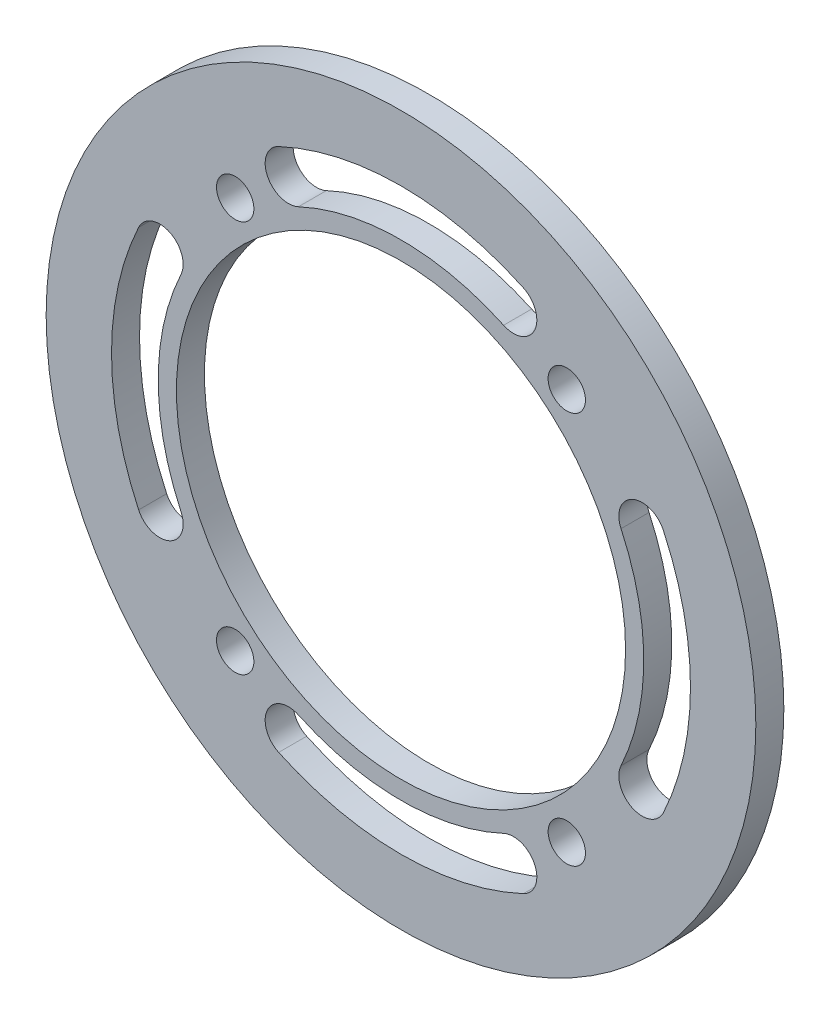
ISO-10303-21;
HEADER;
FILE_DESCRIPTION(('STEP AP214'),'2;1');
FILE_NAME('part.step','',(''),(''),'','','');
FILE_SCHEMA(('AUTOMOTIVE_DESIGN { 1 0 10303 214 1 1 1 1 }'));
ENDSEC;
DATA;
#1=APPLICATION_CONTEXT('core data for automotive mechanical design processes');
#2=APPLICATION_PROTOCOL_DEFINITION('international standard','automotive_design',2000,#1);
#3=PRODUCT_CONTEXT('',#1,'mechanical');
#4=PRODUCT('Part','Part','',(#3));
#5=PRODUCT_RELATED_PRODUCT_CATEGORY('part','',(#4));
#6=PRODUCT_DEFINITION_FORMATION('','',#4);
#7=PRODUCT_DEFINITION_CONTEXT('part definition',#1,'design');
#8=PRODUCT_DEFINITION('design','',#6,#7);
#9=PRODUCT_DEFINITION_SHAPE('','',#8);
#10=(LENGTH_UNIT() NAMED_UNIT(*) SI_UNIT(.MILLI.,.METRE.));
#11=(NAMED_UNIT(*) PLANE_ANGLE_UNIT() SI_UNIT($,.RADIAN.));
#12=(NAMED_UNIT(*) SI_UNIT($,.STERADIAN.) SOLID_ANGLE_UNIT());
#13=UNCERTAINTY_MEASURE_WITH_UNIT(LENGTH_MEASURE(1.E-05),#10,'distance_accuracy_value','');
#14=(GEOMETRIC_REPRESENTATION_CONTEXT(3) GLOBAL_UNCERTAINTY_ASSIGNED_CONTEXT((#13)) GLOBAL_UNIT_ASSIGNED_CONTEXT((#10,
#11,#12)) REPRESENTATION_CONTEXT('',''));
#15=CARTESIAN_POINT('',(0.,0.,0.));
#16=DIRECTION('',(0.,0.,1.));
#17=DIRECTION('',(1.,0.,0.));
#18=AXIS2_PLACEMENT_3D('',#15,#16,#17);
#19=CARTESIAN_POINT('',(0.,0.,3.));
#20=DIRECTION('',(0.,0.,1.));
#21=DIRECTION('',(1.,0.,0.));
#22=AXIS2_PLACEMENT_3D('',#19,#20,#21);
#23=PLANE('',#22);
#24=CARTESIAN_POINT('',(25.8297719305446,-12.0446204596098,3.));
#25=DIRECTION('',(0.,0.,1.));
#26=DIRECTION('',(1.,0.,0.));
#27=AXIS2_PLACEMENT_3D('',#24,#25,#26);
#28=CIRCLE('',#27,2.49999999999999);
#29=CARTESIAN_POINT('',(23.564002462953,-10.988074805258,3.));
#30=VERTEX_POINT('',#29);
#31=CARTESIAN_POINT('',(28.0955413981362,-13.1011661139615,3.));
#32=VERTEX_POINT('',#31);
#33=EDGE_CURVE('E51',#30,#32,#28,.T.);
#34=ORIENTED_EDGE('',*,*,#33,.F.);
#35=CARTESIAN_POINT('',(0.,0.,3.));
#36=DIRECTION('',(0.,0.,-1.));
#37=DIRECTION('',(1.,0.,0.));
#38=AXIS2_PLACEMENT_3D('',#35,#36,#37);
#39=CIRCLE('',#38,26.);
#40=CARTESIAN_POINT('',(23.564002462953,10.988074805258,3.));
#41=VERTEX_POINT('',#40);
#42=EDGE_CURVE('E172',#41,#30,#39,.T.);
#43=ORIENTED_EDGE('',*,*,#42,.F.);
#44=CARTESIAN_POINT('',(25.8297719305446,12.0446204596098,3.));
#45=DIRECTION('',(0.,0.,1.));
#46=DIRECTION('',(1.,0.,0.));
#47=AXIS2_PLACEMENT_3D('',#44,#45,#46);
#48=CIRCLE('',#47,2.5);
#49=CARTESIAN_POINT('',(28.0955413981362,13.1011661139615,3.));
#50=VERTEX_POINT('',#49);
#51=EDGE_CURVE('E156',#50,#41,#48,.T.);
#52=ORIENTED_EDGE('',*,*,#51,.F.);
#53=CARTESIAN_POINT('',(0.,0.,3.));
#54=DIRECTION('',(0.,0.,1.));
#55=DIRECTION('',(1.,0.,0.));
#56=AXIS2_PLACEMENT_3D('',#53,#54,#55);
#57=CIRCLE('',#56,31.);
#58=EDGE_CURVE('E166',#32,#50,#57,.T.);
#59=ORIENTED_EDGE('',*,*,#58,.F.);
#60=EDGE_LOOP('',(#34,#43,#52,#59));
#61=FACE_BOUND('',#60,.T.);
#62=CARTESIAN_POINT('',(-12.0446204596099,-25.8297719305446,3.));
#63=DIRECTION('',(0.,0.,1.));
#64=DIRECTION('',(1.,0.,0.));
#65=AXIS2_PLACEMENT_3D('',#62,#63,#64);
#66=CIRCLE('',#65,2.5);
#67=CARTESIAN_POINT('',(-10.9880748052581,-23.5640024629529,3.));
#68=VERTEX_POINT('',#67);
#69=CARTESIAN_POINT('',(-13.1011661139616,-28.0955413981362,3.));
#70=VERTEX_POINT('',#69);
#71=EDGE_CURVE('E59',#68,#70,#66,.T.);
#72=ORIENTED_EDGE('',*,*,#71,.F.);
#73=CARTESIAN_POINT('',(0.,0.,3.));
#74=DIRECTION('',(0.,0.,-1.));
#75=DIRECTION('',(1.,0.,0.));
#76=AXIS2_PLACEMENT_3D('',#73,#74,#75);
#77=CIRCLE('',#76,26.);
#78=CARTESIAN_POINT('',(10.988074805258,-23.564002462953,3.));
#79=VERTEX_POINT('',#78);
#80=EDGE_CURVE('E190',#79,#68,#77,.T.);
#81=ORIENTED_EDGE('',*,*,#80,.F.);
#82=CARTESIAN_POINT('',(12.0446204596097,-25.8297719305446,3.));
#83=DIRECTION('',(0.,0.,1.));
#84=DIRECTION('',(1.,0.,0.));
#85=AXIS2_PLACEMENT_3D('',#82,#83,#84);
#86=CIRCLE('',#85,2.49999999999999);
#87=CARTESIAN_POINT('',(13.1011661139614,-28.0955413981363,3.));
#88=VERTEX_POINT('',#87);
#89=EDGE_CURVE('E187',#88,#79,#86,.T.);
#90=ORIENTED_EDGE('',*,*,#89,.F.);
#91=CARTESIAN_POINT('',(0.,0.,3.));
#92=DIRECTION('',(0.,0.,1.));
#93=DIRECTION('',(1.,0.,0.));
#94=AXIS2_PLACEMENT_3D('',#91,#92,#93);
#95=CIRCLE('',#94,31.);
#96=EDGE_CURVE('E183',#70,#88,#95,.T.);
#97=ORIENTED_EDGE('',*,*,#96,.F.);
#98=EDGE_LOOP('',(#72,#81,#90,#97));
#99=FACE_BOUND('',#98,.T.);
#100=CARTESIAN_POINT('',(-25.8297719305445,12.0446204596099,3.));
#101=DIRECTION('',(0.,0.,1.));
#102=DIRECTION('',(1.,0.,0.));
#103=AXIS2_PLACEMENT_3D('',#100,#101,#102);
#104=CIRCLE('',#103,2.49999999999999);
#105=CARTESIAN_POINT('',(-23.5640024629529,10.9880748052582,3.));
#106=VERTEX_POINT('',#105);
#107=CARTESIAN_POINT('',(-28.0955413981361,13.1011661139617,3.));
#108=VERTEX_POINT('',#107);
#109=EDGE_CURVE('E201',#106,#108,#104,.T.);
#110=ORIENTED_EDGE('',*,*,#109,.F.);
#111=CARTESIAN_POINT('',(0.,0.,3.));
#112=DIRECTION('',(0.,0.,-1.));
#113=DIRECTION('',(1.,0.,0.));
#114=AXIS2_PLACEMENT_3D('',#111,#112,#113);
#115=CIRCLE('',#114,26.);
#116=CARTESIAN_POINT('',(-23.564002462953,-10.9880748052579,3.));
#117=VERTEX_POINT('',#116);
#118=EDGE_CURVE('E210',#117,#106,#115,.T.);
#119=ORIENTED_EDGE('',*,*,#118,.F.);
#120=CARTESIAN_POINT('',(-25.8297719305447,-12.0446204596096,3.));
#121=DIRECTION('',(0.,0.,1.));
#122=DIRECTION('',(1.,0.,0.));
#123=AXIS2_PLACEMENT_3D('',#120,#121,#122);
#124=CIRCLE('',#123,2.5);
#125=CARTESIAN_POINT('',(-28.0955413981363,-13.1011661139613,3.));
#126=VERTEX_POINT('',#125);
#127=EDGE_CURVE('E207',#126,#117,#124,.T.);
#128=ORIENTED_EDGE('',*,*,#127,.F.);
#129=CARTESIAN_POINT('',(0.,0.,3.));
#130=DIRECTION('',(0.,0.,1.));
#131=DIRECTION('',(1.,0.,0.));
#132=AXIS2_PLACEMENT_3D('',#129,#130,#131);
#133=CIRCLE('',#132,31.);
#134=EDGE_CURVE('E203',#108,#126,#133,.T.);
#135=ORIENTED_EDGE('',*,*,#134,.F.);
#136=EDGE_LOOP('',(#110,#119,#128,#135));
#137=FACE_BOUND('',#136,.T.);
#138=CARTESIAN_POINT('',(12.04462045961,25.8297719305445,3.));
#139=DIRECTION('',(0.,0.,1.));
#140=DIRECTION('',(1.,0.,0.));
#141=AXIS2_PLACEMENT_3D('',#138,#139,#140);
#142=CIRCLE('',#141,2.49999999999999);
#143=CARTESIAN_POINT('',(10.9880748052583,23.5640024629528,3.));
#144=VERTEX_POINT('',#143);
#145=CARTESIAN_POINT('',(13.1011661139618,28.0955413981361,3.));
#146=VERTEX_POINT('',#145);
#147=EDGE_CURVE('E221',#144,#146,#142,.T.);
#148=ORIENTED_EDGE('',*,*,#147,.F.);
#149=CARTESIAN_POINT('',(0.,0.,3.));
#150=DIRECTION('',(0.,0.,-1.));
#151=DIRECTION('',(1.,0.,0.));
#152=AXIS2_PLACEMENT_3D('',#149,#150,#151);
#153=CIRCLE('',#152,26.);
#154=CARTESIAN_POINT('',(-10.9880748052578,23.5640024629531,3.));
#155=VERTEX_POINT('',#154);
#156=EDGE_CURVE('E229',#155,#144,#153,.T.);
#157=ORIENTED_EDGE('',*,*,#156,.F.);
#158=CARTESIAN_POINT('',(-12.0446204596095,25.8297719305447,3.));
#159=DIRECTION('',(0.,0.,1.));
#160=DIRECTION('',(1.,0.,0.));
#161=AXIS2_PLACEMENT_3D('',#158,#159,#160);
#162=CIRCLE('',#161,2.5);
#163=CARTESIAN_POINT('',(-13.1011661139612,28.0955413981364,3.));
#164=VERTEX_POINT('',#163);
#165=EDGE_CURVE('E226',#164,#155,#162,.T.);
#166=ORIENTED_EDGE('',*,*,#165,.F.);
#167=CARTESIAN_POINT('',(0.,0.,3.));
#168=DIRECTION('',(0.,0.,1.));
#169=DIRECTION('',(1.,0.,0.));
#170=AXIS2_PLACEMENT_3D('',#167,#168,#169);
#171=CIRCLE('',#170,31.);
#172=EDGE_CURVE('E223',#146,#164,#171,.T.);
#173=ORIENTED_EDGE('',*,*,#172,.F.);
#174=EDGE_LOOP('',(#148,#157,#166,#173));
#175=FACE_BOUND('',#174,.T.);
#176=CARTESIAN_POINT('',(17.7552809045647,21.,3.));
#177=DIRECTION('',(0.,0.,1.));
#178=DIRECTION('',(-1.,0.,0.));
#179=AXIS2_PLACEMENT_3D('',#176,#177,#178);
#180=CIRCLE('',#179,2.);
#181=CARTESIAN_POINT('',(15.7552809045647,21.,3.));
#182=VERTEX_POINT('',#181);
#183=EDGE_CURVE('E243',#182,#182,#180,.T.);
#184=ORIENTED_EDGE('',*,*,#183,.F.);
#185=EDGE_LOOP('',(#184));
#186=FACE_BOUND('',#185,.T.);
#187=CARTESIAN_POINT('',(-17.7552809045647,-21.,3.));
#188=DIRECTION('',(0.,0.,1.));
#189=DIRECTION('',(-1.,0.,0.));
#190=AXIS2_PLACEMENT_3D('',#187,#188,#189);
#191=CIRCLE('',#190,2.);
#192=CARTESIAN_POINT('',(-19.7552809045647,-21.,3.));
#193=VERTEX_POINT('',#192);
#194=EDGE_CURVE('E242',#193,#193,#191,.T.);
#195=ORIENTED_EDGE('',*,*,#194,.F.);
#196=EDGE_LOOP('',(#195));
#197=FACE_BOUND('',#196,.T.);
#198=CARTESIAN_POINT('',(-17.7552809045647,21.,3.));
#199=DIRECTION('',(0.,0.,1.));
#200=DIRECTION('',(1.,0.,0.));
#201=AXIS2_PLACEMENT_3D('',#198,#199,#200);
#202=CIRCLE('',#201,2.);
#203=CARTESIAN_POINT('',(-15.7552809045647,21.,3.));
#204=VERTEX_POINT('',#203);
#205=EDGE_CURVE('E179',#204,#204,#202,.T.);
#206=ORIENTED_EDGE('',*,*,#205,.F.);
#207=EDGE_LOOP('',(#206));
#208=FACE_BOUND('',#207,.T.);
#209=CARTESIAN_POINT('',(17.7552809045647,-21.,3.));
#210=DIRECTION('',(0.,0.,1.));
#211=DIRECTION('',(1.,0.,0.));
#212=AXIS2_PLACEMENT_3D('',#209,#210,#211);
#213=CIRCLE('',#212,2.);
#214=CARTESIAN_POINT('',(19.7552809045647,-21.,3.));
#215=VERTEX_POINT('',#214);
#216=EDGE_CURVE('E246',#215,#215,#213,.T.);
#217=ORIENTED_EDGE('',*,*,#216,.F.);
#218=EDGE_LOOP('',(#217));
#219=FACE_BOUND('',#218,.T.);
#220=CARTESIAN_POINT('',(0.,0.,3.));
#221=DIRECTION('',(0.,0.,1.));
#222=DIRECTION('',(1.,0.,0.));
#223=AXIS2_PLACEMENT_3D('',#220,#221,#222);
#224=CIRCLE('',#223,38.);
#225=CARTESIAN_POINT('',(38.,0.,3.));
#226=VERTEX_POINT('',#225);
#227=EDGE_CURVE('E260',#226,#226,#224,.T.);
#228=ORIENTED_EDGE('',*,*,#227,.T.);
#229=EDGE_LOOP('',(#228));
#230=FACE_BOUND('',#229,.T.);
#231=CARTESIAN_POINT('',(0.,0.,3.));
#232=DIRECTION('',(0.,0.,1.));
#233=DIRECTION('',(1.,0.,0.));
#234=AXIS2_PLACEMENT_3D('',#231,#232,#233);
#235=CIRCLE('',#234,24.05);
#236=CARTESIAN_POINT('',(24.05,0.,3.));
#237=VERTEX_POINT('',#236);
#238=EDGE_CURVE('E252',#237,#237,#235,.T.);
#239=ORIENTED_EDGE('',*,*,#238,.F.);
#240=EDGE_LOOP('',(#239));
#241=FACE_BOUND('',#240,.T.);
#242=ADVANCED_FACE('F36',(#61,#99,#137,#175,#186,#197,#208,#219,#230,#241),#23,.T.);
#243=CARTESIAN_POINT('',(0.,0.,0.));
#244=DIRECTION('',(0.,0.,1.));
#245=DIRECTION('',(1.,0.,0.));
#246=AXIS2_PLACEMENT_3D('',#243,#244,#245);
#247=PLANE('',#246);
#248=CARTESIAN_POINT('',(0.,0.,0.));
#249=DIRECTION('',(0.,0.,1.));
#250=DIRECTION('',(1.,0.,0.));
#251=AXIS2_PLACEMENT_3D('',#248,#249,#250);
#252=CIRCLE('',#251,26.);
#253=CARTESIAN_POINT('',(23.564002462953,10.988074805258,0.));
#254=VERTEX_POINT('',#253);
#255=CARTESIAN_POINT('',(23.564002462953,-10.988074805258,0.));
#256=VERTEX_POINT('',#255);
#257=EDGE_CURVE('E44',#254,#256,#252,.F.);
#258=ORIENTED_EDGE('',*,*,#257,.T.);
#259=CARTESIAN_POINT('',(25.8297719305446,-12.0446204596098,0.));
#260=DIRECTION('',(0.,0.,1.));
#261=DIRECTION('',(1.,0.,0.));
#262=AXIS2_PLACEMENT_3D('',#259,#260,#261);
#263=CIRCLE('',#262,2.49999999999999);
#264=CARTESIAN_POINT('',(28.0955413981362,-13.1011661139615,0.));
#265=VERTEX_POINT('',#264);
#266=EDGE_CURVE('E11',#256,#265,#263,.T.);
#267=ORIENTED_EDGE('',*,*,#266,.T.);
#268=CARTESIAN_POINT('',(0.,0.,0.));
#269=DIRECTION('',(0.,0.,1.));
#270=DIRECTION('',(1.,0.,0.));
#271=AXIS2_PLACEMENT_3D('',#268,#269,#270);
#272=CIRCLE('',#271,31.);
#273=CARTESIAN_POINT('',(28.0955413981362,13.1011661139615,0.));
#274=VERTEX_POINT('',#273);
#275=EDGE_CURVE('E311',#265,#274,#272,.T.);
#276=ORIENTED_EDGE('',*,*,#275,.T.);
#277=CARTESIAN_POINT('',(25.8297719305446,12.0446204596098,0.));
#278=DIRECTION('',(0.,0.,1.));
#279=DIRECTION('',(1.,0.,0.));
#280=AXIS2_PLACEMENT_3D('',#277,#278,#279);
#281=CIRCLE('',#280,2.5);
#282=EDGE_CURVE('E159',#274,#254,#281,.T.);
#283=ORIENTED_EDGE('',*,*,#282,.T.);
#284=EDGE_LOOP('',(#258,#267,#276,#283));
#285=FACE_BOUND('',#284,.T.);
#286=CARTESIAN_POINT('',(0.,0.,0.));
#287=DIRECTION('',(0.,0.,1.));
#288=DIRECTION('',(1.,0.,0.));
#289=AXIS2_PLACEMENT_3D('',#286,#287,#288);
#290=CIRCLE('',#289,26.);
#291=CARTESIAN_POINT('',(10.988074805258,-23.564002462953,0.));
#292=VERTEX_POINT('',#291);
#293=CARTESIAN_POINT('',(-10.9880748052581,-23.5640024629529,0.));
#294=VERTEX_POINT('',#293);
#295=EDGE_CURVE('E305',#292,#294,#290,.F.);
#296=ORIENTED_EDGE('',*,*,#295,.T.);
#297=CARTESIAN_POINT('',(-12.0446204596099,-25.8297719305446,0.));
#298=DIRECTION('',(0.,0.,1.));
#299=DIRECTION('',(1.,0.,0.));
#300=AXIS2_PLACEMENT_3D('',#297,#298,#299);
#301=CIRCLE('',#300,2.5);
#302=CARTESIAN_POINT('',(-13.1011661139616,-28.0955413981362,0.));
#303=VERTEX_POINT('',#302);
#304=EDGE_CURVE('E308',#294,#303,#301,.T.);
#305=ORIENTED_EDGE('',*,*,#304,.T.);
#306=CARTESIAN_POINT('',(0.,0.,0.));
#307=DIRECTION('',(0.,0.,1.));
#308=DIRECTION('',(1.,0.,0.));
#309=AXIS2_PLACEMENT_3D('',#306,#307,#308);
#310=CIRCLE('',#309,31.);
#311=CARTESIAN_POINT('',(13.1011661139614,-28.0955413981363,0.));
#312=VERTEX_POINT('',#311);
#313=EDGE_CURVE('E299',#303,#312,#310,.T.);
#314=ORIENTED_EDGE('',*,*,#313,.T.);
#315=CARTESIAN_POINT('',(12.0446204596097,-25.8297719305446,0.));
#316=DIRECTION('',(0.,0.,1.));
#317=DIRECTION('',(1.,0.,0.));
#318=AXIS2_PLACEMENT_3D('',#315,#316,#317);
#319=CIRCLE('',#318,2.49999999999999);
#320=EDGE_CURVE('E302',#312,#292,#319,.T.);
#321=ORIENTED_EDGE('',*,*,#320,.T.);
#322=EDGE_LOOP('',(#296,#305,#314,#321));
#323=FACE_BOUND('',#322,.T.);
#324=CARTESIAN_POINT('',(0.,0.,0.));
#325=DIRECTION('',(0.,0.,1.));
#326=DIRECTION('',(1.,0.,0.));
#327=AXIS2_PLACEMENT_3D('',#324,#325,#326);
#328=CIRCLE('',#327,26.);
#329=CARTESIAN_POINT('',(-23.564002462953,-10.9880748052579,0.));
#330=VERTEX_POINT('',#329);
#331=CARTESIAN_POINT('',(-23.5640024629529,10.9880748052582,0.));
#332=VERTEX_POINT('',#331);
#333=EDGE_CURVE('E293',#330,#332,#328,.F.);
#334=ORIENTED_EDGE('',*,*,#333,.T.);
#335=CARTESIAN_POINT('',(-25.8297719305445,12.0446204596099,0.));
#336=DIRECTION('',(0.,0.,1.));
#337=DIRECTION('',(1.,0.,0.));
#338=AXIS2_PLACEMENT_3D('',#335,#336,#337);
#339=CIRCLE('',#338,2.49999999999999);
#340=CARTESIAN_POINT('',(-28.0955413981361,13.1011661139617,0.));
#341=VERTEX_POINT('',#340);
#342=EDGE_CURVE('E296',#332,#341,#339,.T.);
#343=ORIENTED_EDGE('',*,*,#342,.T.);
#344=CARTESIAN_POINT('',(0.,0.,0.));
#345=DIRECTION('',(0.,0.,1.));
#346=DIRECTION('',(1.,0.,0.));
#347=AXIS2_PLACEMENT_3D('',#344,#345,#346);
#348=CIRCLE('',#347,31.);
#349=CARTESIAN_POINT('',(-28.0955413981363,-13.1011661139613,0.));
#350=VERTEX_POINT('',#349);
#351=EDGE_CURVE('E287',#341,#350,#348,.T.);
#352=ORIENTED_EDGE('',*,*,#351,.T.);
#353=CARTESIAN_POINT('',(-25.8297719305447,-12.0446204596096,0.));
#354=DIRECTION('',(0.,0.,1.));
#355=DIRECTION('',(1.,0.,0.));
#356=AXIS2_PLACEMENT_3D('',#353,#354,#355);
#357=CIRCLE('',#356,2.5);
#358=EDGE_CURVE('E290',#350,#330,#357,.T.);
#359=ORIENTED_EDGE('',*,*,#358,.T.);
#360=EDGE_LOOP('',(#334,#343,#352,#359));
#361=FACE_BOUND('',#360,.T.);
#362=CARTESIAN_POINT('',(0.,0.,0.));
#363=DIRECTION('',(0.,0.,1.));
#364=DIRECTION('',(1.,0.,0.));
#365=AXIS2_PLACEMENT_3D('',#362,#363,#364);
#366=CIRCLE('',#365,26.);
#367=CARTESIAN_POINT('',(-10.9880748052578,23.5640024629531,0.));
#368=VERTEX_POINT('',#367);
#369=CARTESIAN_POINT('',(10.9880748052583,23.5640024629528,0.));
#370=VERTEX_POINT('',#369);
#371=EDGE_CURVE('E281',#368,#370,#366,.F.);
#372=ORIENTED_EDGE('',*,*,#371,.T.);
#373=CARTESIAN_POINT('',(12.04462045961,25.8297719305445,0.));
#374=DIRECTION('',(0.,0.,1.));
#375=DIRECTION('',(1.,0.,0.));
#376=AXIS2_PLACEMENT_3D('',#373,#374,#375);
#377=CIRCLE('',#376,2.49999999999999);
#378=CARTESIAN_POINT('',(13.1011661139618,28.0955413981361,0.));
#379=VERTEX_POINT('',#378);
#380=EDGE_CURVE('E284',#370,#379,#377,.T.);
#381=ORIENTED_EDGE('',*,*,#380,.T.);
#382=CARTESIAN_POINT('',(0.,0.,0.));
#383=DIRECTION('',(0.,0.,1.));
#384=DIRECTION('',(1.,0.,0.));
#385=AXIS2_PLACEMENT_3D('',#382,#383,#384);
#386=CIRCLE('',#385,31.);
#387=CARTESIAN_POINT('',(-13.1011661139612,28.0955413981364,0.));
#388=VERTEX_POINT('',#387);
#389=EDGE_CURVE('E263',#379,#388,#386,.T.);
#390=ORIENTED_EDGE('',*,*,#389,.T.);
#391=CARTESIAN_POINT('',(-12.0446204596095,25.8297719305447,0.));
#392=DIRECTION('',(0.,0.,1.));
#393=DIRECTION('',(1.,0.,0.));
#394=AXIS2_PLACEMENT_3D('',#391,#392,#393);
#395=CIRCLE('',#394,2.5);
#396=EDGE_CURVE('E278',#388,#368,#395,.T.);
#397=ORIENTED_EDGE('',*,*,#396,.T.);
#398=EDGE_LOOP('',(#372,#381,#390,#397));
#399=FACE_BOUND('',#398,.T.);
#400=CARTESIAN_POINT('',(17.7552809045647,21.,0.));
#401=DIRECTION('',(0.,0.,1.));
#402=DIRECTION('',(1.,0.,0.));
#403=AXIS2_PLACEMENT_3D('',#400,#401,#402);
#404=CIRCLE('',#403,2.);
#405=CARTESIAN_POINT('',(19.7552809045647,21.,0.));
#406=VERTEX_POINT('',#405);
#407=EDGE_CURVE('E259',#406,#406,#404,.T.);
#408=ORIENTED_EDGE('',*,*,#407,.T.);
#409=EDGE_LOOP('',(#408));
#410=FACE_BOUND('',#409,.T.);
#411=CARTESIAN_POINT('',(-17.7552809045647,-21.,0.));
#412=DIRECTION('',(0.,0.,1.));
#413=DIRECTION('',(1.,0.,0.));
#414=AXIS2_PLACEMENT_3D('',#411,#412,#413);
#415=CIRCLE('',#414,2.);
#416=CARTESIAN_POINT('',(-15.7552809045647,-21.,0.));
#417=VERTEX_POINT('',#416);
#418=EDGE_CURVE('E271',#417,#417,#415,.T.);
#419=ORIENTED_EDGE('',*,*,#418,.T.);
#420=EDGE_LOOP('',(#419));
#421=FACE_BOUND('',#420,.T.);
#422=CARTESIAN_POINT('',(-17.7552809045647,21.,0.));
#423=DIRECTION('',(0.,0.,1.));
#424=DIRECTION('',(1.,0.,0.));
#425=AXIS2_PLACEMENT_3D('',#422,#423,#424);
#426=CIRCLE('',#425,2.);
#427=CARTESIAN_POINT('',(-15.7552809045647,21.,0.));
#428=VERTEX_POINT('',#427);
#429=EDGE_CURVE('E268',#428,#428,#426,.T.);
#430=ORIENTED_EDGE('',*,*,#429,.T.);
#431=EDGE_LOOP('',(#430));
#432=FACE_BOUND('',#431,.T.);
#433=CARTESIAN_POINT('',(17.7552809045647,-21.,0.));
#434=DIRECTION('',(0.,0.,1.));
#435=DIRECTION('',(1.,0.,0.));
#436=AXIS2_PLACEMENT_3D('',#433,#434,#435);
#437=CIRCLE('',#436,2.);
#438=CARTESIAN_POINT('',(19.7552809045647,-21.,0.));
#439=VERTEX_POINT('',#438);
#440=EDGE_CURVE('E251',#439,#439,#437,.T.);
#441=ORIENTED_EDGE('',*,*,#440,.T.);
#442=EDGE_LOOP('',(#441));
#443=FACE_BOUND('',#442,.T.);
#444=CARTESIAN_POINT('',(0.,0.,0.));
#445=DIRECTION('',(0.,0.,1.));
#446=DIRECTION('',(1.,0.,0.));
#447=AXIS2_PLACEMENT_3D('',#444,#445,#446);
#448=CIRCLE('',#447,38.);
#449=CARTESIAN_POINT('',(38.,0.,0.));
#450=VERTEX_POINT('',#449);
#451=EDGE_CURVE('E255',#450,#450,#448,.T.);
#452=ORIENTED_EDGE('',*,*,#451,.F.);
#453=EDGE_LOOP('',(#452));
#454=FACE_BOUND('',#453,.T.);
#455=CARTESIAN_POINT('',(0.,0.,0.));
#456=DIRECTION('',(0.,0.,1.));
#457=DIRECTION('',(1.,0.,0.));
#458=AXIS2_PLACEMENT_3D('',#455,#456,#457);
#459=CIRCLE('',#458,24.05);
#460=CARTESIAN_POINT('',(24.05,0.,0.));
#461=VERTEX_POINT('',#460);
#462=EDGE_CURVE('E256',#461,#461,#459,.T.);
#463=ORIENTED_EDGE('',*,*,#462,.T.);
#464=EDGE_LOOP('',(#463));
#465=FACE_BOUND('',#464,.T.);
#466=ADVANCED_FACE('F315',(#285,#323,#361,#399,#410,#421,#432,#443,#454,#465),#247,.F.);
#467=CARTESIAN_POINT('',(0.,0.,3.));
#468=DIRECTION('',(0.,0.,-1.));
#469=DIRECTION('',(-1.,0.,0.));
#470=AXIS2_PLACEMENT_3D('',#467,#468,#469);
#471=CYLINDRICAL_SURFACE('',#470,38.);
#472=ORIENTED_EDGE('',*,*,#227,.F.);
#473=EDGE_LOOP('',(#472));
#474=FACE_BOUND('',#473,.T.);
#475=ORIENTED_EDGE('',*,*,#451,.T.);
#476=EDGE_LOOP('',(#475));
#477=FACE_BOUND('',#476,.T.);
#478=ADVANCED_FACE('F38',(#474,#477),#471,.T.);
#479=CARTESIAN_POINT('',(0.,0.,3.));
#480=DIRECTION('',(0.,0.,-1.));
#481=DIRECTION('',(-1.,0.,0.));
#482=AXIS2_PLACEMENT_3D('',#479,#480,#481);
#483=CYLINDRICAL_SURFACE('',#482,24.05);
#484=ORIENTED_EDGE('',*,*,#238,.T.);
#485=EDGE_LOOP('',(#484));
#486=FACE_BOUND('',#485,.T.);
#487=ORIENTED_EDGE('',*,*,#462,.F.);
#488=EDGE_LOOP('',(#487));
#489=FACE_BOUND('',#488,.T.);
#490=ADVANCED_FACE('F340',(#486,#489),#483,.F.);
#491=CARTESIAN_POINT('',(17.7552809045647,-21.,-7.));
#492=DIRECTION('',(0.,0.,1.));
#493=DIRECTION('',(1.,0.,0.));
#494=AXIS2_PLACEMENT_3D('',#491,#492,#493);
#495=CYLINDRICAL_SURFACE('',#494,2.);
#496=ORIENTED_EDGE('',*,*,#216,.T.);
#497=EDGE_LOOP('',(#496));
#498=FACE_BOUND('',#497,.T.);
#499=ORIENTED_EDGE('',*,*,#440,.F.);
#500=EDGE_LOOP('',(#499));
#501=FACE_BOUND('',#500,.T.);
#502=ADVANCED_FACE('F343',(#498,#501),#495,.F.);
#503=CARTESIAN_POINT('',(-17.7552809045647,21.,-7.));
#504=DIRECTION('',(0.,0.,1.));
#505=DIRECTION('',(1.,0.,0.));
#506=AXIS2_PLACEMENT_3D('',#503,#504,#505);
#507=CYLINDRICAL_SURFACE('',#506,2.);
#508=ORIENTED_EDGE('',*,*,#205,.T.);
#509=EDGE_LOOP('',(#508));
#510=FACE_BOUND('',#509,.T.);
#511=ORIENTED_EDGE('',*,*,#429,.F.);
#512=EDGE_LOOP('',(#511));
#513=FACE_BOUND('',#512,.T.);
#514=ADVANCED_FACE('F347',(#510,#513),#507,.F.);
#515=CARTESIAN_POINT('',(-17.7552809045647,-21.,-7.));
#516=DIRECTION('',(0.,0.,1.));
#517=DIRECTION('',(1.,0.,0.));
#518=AXIS2_PLACEMENT_3D('',#515,#516,#517);
#519=CYLINDRICAL_SURFACE('',#518,2.);
#520=ORIENTED_EDGE('',*,*,#194,.T.);
#521=EDGE_LOOP('',(#520));
#522=FACE_BOUND('',#521,.T.);
#523=ORIENTED_EDGE('',*,*,#418,.F.);
#524=EDGE_LOOP('',(#523));
#525=FACE_BOUND('',#524,.T.);
#526=ADVANCED_FACE('F349',(#522,#525),#519,.F.);
#527=CARTESIAN_POINT('',(17.7552809045647,21.,-7.));
#528=DIRECTION('',(0.,0.,1.));
#529=DIRECTION('',(1.,0.,0.));
#530=AXIS2_PLACEMENT_3D('',#527,#528,#529);
#531=CYLINDRICAL_SURFACE('',#530,2.);
#532=ORIENTED_EDGE('',*,*,#183,.T.);
#533=EDGE_LOOP('',(#532));
#534=FACE_BOUND('',#533,.T.);
#535=ORIENTED_EDGE('',*,*,#407,.F.);
#536=EDGE_LOOP('',(#535));
#537=FACE_BOUND('',#536,.T.);
#538=ADVANCED_FACE('F352',(#534,#537),#531,.F.);
#539=CARTESIAN_POINT('',(12.04462045961,25.8297719305445,-7.));
#540=DIRECTION('',(0.,0.,1.));
#541=DIRECTION('',(1.,0.,0.));
#542=AXIS2_PLACEMENT_3D('',#539,#540,#541);
#543=CYLINDRICAL_SURFACE('',#542,2.49999999999999);
#544=DIRECTION('',(0.,0.,1.));
#545=VECTOR('',#544,1.);
#546=CARTESIAN_POINT('',(10.9880748052583,23.5640024629528,-7.));
#547=LINE('',#546,#545);
#548=EDGE_CURVE('E204',#370,#144,#547,.T.);
#549=ORIENTED_EDGE('',*,*,#548,.T.);
#550=ORIENTED_EDGE('',*,*,#147,.T.);
#551=DIRECTION('',(0.,0.,1.));
#552=VECTOR('',#551,1.);
#553=CARTESIAN_POINT('',(13.1011661139618,28.0955413981361,-7.));
#554=LINE('',#553,#552);
#555=EDGE_CURVE('E232',#379,#146,#554,.T.);
#556=ORIENTED_EDGE('',*,*,#555,.F.);
#557=ORIENTED_EDGE('',*,*,#380,.F.);
#558=EDGE_LOOP('',(#549,#550,#556,#557));
#559=FACE_BOUND('',#558,.T.);
#560=ADVANCED_FACE('F356',(#559),#543,.F.);
#561=CARTESIAN_POINT('',(0.,0.,-7.));
#562=DIRECTION('',(0.,0.,1.));
#563=DIRECTION('',(1.,0.,0.));
#564=AXIS2_PLACEMENT_3D('',#561,#562,#563);
#565=CYLINDRICAL_SURFACE('',#564,26.);
#566=DIRECTION('',(0.,0.,1.));
#567=VECTOR('',#566,1.);
#568=CARTESIAN_POINT('',(-10.9880748052578,23.5640024629531,-7.));
#569=LINE('',#568,#567);
#570=EDGE_CURVE('E234',#368,#155,#569,.T.);
#571=ORIENTED_EDGE('',*,*,#570,.T.);
#572=ORIENTED_EDGE('',*,*,#156,.T.);
#573=ORIENTED_EDGE('',*,*,#548,.F.);
#574=ORIENTED_EDGE('',*,*,#371,.F.);
#575=EDGE_LOOP('',(#571,#572,#573,#574));
#576=FACE_BOUND('',#575,.T.);
#577=ADVANCED_FACE('F363',(#576),#565,.T.);
#578=CARTESIAN_POINT('',(-12.0446204596095,25.8297719305447,-7.));
#579=DIRECTION('',(0.,0.,1.));
#580=DIRECTION('',(1.,0.,0.));
#581=AXIS2_PLACEMENT_3D('',#578,#579,#580);
#582=CYLINDRICAL_SURFACE('',#581,2.5);
#583=DIRECTION('',(0.,0.,1.));
#584=VECTOR('',#583,1.);
#585=CARTESIAN_POINT('',(-13.1011661139612,28.0955413981364,-7.));
#586=LINE('',#585,#584);
#587=EDGE_CURVE('E236',#388,#164,#586,.T.);
#588=ORIENTED_EDGE('',*,*,#587,.T.);
#589=ORIENTED_EDGE('',*,*,#165,.T.);
#590=ORIENTED_EDGE('',*,*,#570,.F.);
#591=ORIENTED_EDGE('',*,*,#396,.F.);
#592=EDGE_LOOP('',(#588,#589,#590,#591));
#593=FACE_BOUND('',#592,.T.);
#594=ADVANCED_FACE('F369',(#593),#582,.F.);
#595=CARTESIAN_POINT('',(0.,0.,-7.));
#596=DIRECTION('',(0.,0.,1.));
#597=DIRECTION('',(1.,0.,0.));
#598=AXIS2_PLACEMENT_3D('',#595,#596,#597);
#599=CYLINDRICAL_SURFACE('',#598,31.);
#600=ORIENTED_EDGE('',*,*,#555,.T.);
#601=ORIENTED_EDGE('',*,*,#172,.T.);
#602=ORIENTED_EDGE('',*,*,#587,.F.);
#603=ORIENTED_EDGE('',*,*,#389,.F.);
#604=EDGE_LOOP('',(#600,#601,#602,#603));
#605=FACE_BOUND('',#604,.T.);
#606=ADVANCED_FACE('F365',(#605),#599,.F.);
#607=CARTESIAN_POINT('',(-25.8297719305445,12.0446204596099,-7.));
#608=DIRECTION('',(0.,0.,1.));
#609=DIRECTION('',(1.,0.,0.));
#610=AXIS2_PLACEMENT_3D('',#607,#608,#609);
#611=CYLINDRICAL_SURFACE('',#610,2.49999999999999);
#612=DIRECTION('',(0.,0.,1.));
#613=VECTOR('',#612,1.);
#614=CARTESIAN_POINT('',(-23.5640024629529,10.9880748052582,-7.));
#615=LINE('',#614,#613);
#616=EDGE_CURVE('E184',#332,#106,#615,.T.);
#617=ORIENTED_EDGE('',*,*,#616,.T.);
#618=ORIENTED_EDGE('',*,*,#109,.T.);
#619=DIRECTION('',(0.,0.,1.));
#620=VECTOR('',#619,1.);
#621=CARTESIAN_POINT('',(-28.0955413981361,13.1011661139617,-7.));
#622=LINE('',#621,#620);
#623=EDGE_CURVE('E213',#341,#108,#622,.T.);
#624=ORIENTED_EDGE('',*,*,#623,.F.);
#625=ORIENTED_EDGE('',*,*,#342,.F.);
#626=EDGE_LOOP('',(#617,#618,#624,#625));
#627=FACE_BOUND('',#626,.T.);
#628=ADVANCED_FACE('F368',(#627),#611,.F.);
#629=CARTESIAN_POINT('',(0.,0.,-7.));
#630=DIRECTION('',(0.,0.,1.));
#631=DIRECTION('',(1.,0.,0.));
#632=AXIS2_PLACEMENT_3D('',#629,#630,#631);
#633=CYLINDRICAL_SURFACE('',#632,26.);
#634=DIRECTION('',(0.,0.,1.));
#635=VECTOR('',#634,1.);
#636=CARTESIAN_POINT('',(-23.564002462953,-10.9880748052579,-7.));
#637=LINE('',#636,#635);
#638=EDGE_CURVE('E215',#330,#117,#637,.T.);
#639=ORIENTED_EDGE('',*,*,#638,.T.);
#640=ORIENTED_EDGE('',*,*,#118,.T.);
#641=ORIENTED_EDGE('',*,*,#616,.F.);
#642=ORIENTED_EDGE('',*,*,#333,.F.);
#643=EDGE_LOOP('',(#639,#640,#641,#642));
#644=FACE_BOUND('',#643,.T.);
#645=ADVANCED_FACE('F379',(#644),#633,.T.);
#646=CARTESIAN_POINT('',(-25.8297719305447,-12.0446204596096,-7.));
#647=DIRECTION('',(0.,0.,1.));
#648=DIRECTION('',(1.,0.,0.));
#649=AXIS2_PLACEMENT_3D('',#646,#647,#648);
#650=CYLINDRICAL_SURFACE('',#649,2.5);
#651=DIRECTION('',(0.,0.,1.));
#652=VECTOR('',#651,1.);
#653=CARTESIAN_POINT('',(-28.0955413981363,-13.1011661139613,-7.));
#654=LINE('',#653,#652);
#655=EDGE_CURVE('E217',#350,#126,#654,.T.);
#656=ORIENTED_EDGE('',*,*,#655,.T.);
#657=ORIENTED_EDGE('',*,*,#127,.T.);
#658=ORIENTED_EDGE('',*,*,#638,.F.);
#659=ORIENTED_EDGE('',*,*,#358,.F.);
#660=EDGE_LOOP('',(#656,#657,#658,#659));
#661=FACE_BOUND('',#660,.T.);
#662=ADVANCED_FACE('F385',(#661),#650,.F.);
#663=CARTESIAN_POINT('',(0.,0.,-7.));
#664=DIRECTION('',(0.,0.,1.));
#665=DIRECTION('',(1.,0.,0.));
#666=AXIS2_PLACEMENT_3D('',#663,#664,#665);
#667=CYLINDRICAL_SURFACE('',#666,31.);
#668=ORIENTED_EDGE('',*,*,#623,.T.);
#669=ORIENTED_EDGE('',*,*,#134,.T.);
#670=ORIENTED_EDGE('',*,*,#655,.F.);
#671=ORIENTED_EDGE('',*,*,#351,.F.);
#672=EDGE_LOOP('',(#668,#669,#670,#671));
#673=FACE_BOUND('',#672,.T.);
#674=ADVANCED_FACE('F381',(#673),#667,.F.);
#675=CARTESIAN_POINT('',(-12.0446204596099,-25.8297719305446,-7.));
#676=DIRECTION('',(0.,0.,1.));
#677=DIRECTION('',(1.,0.,0.));
#678=AXIS2_PLACEMENT_3D('',#675,#676,#677);
#679=CYLINDRICAL_SURFACE('',#678,2.5);
#680=DIRECTION('',(0.,0.,1.));
#681=VECTOR('',#680,1.);
#682=CARTESIAN_POINT('',(-10.9880748052581,-23.5640024629529,-7.));
#683=LINE('',#682,#681);
#684=EDGE_CURVE('E194',#294,#68,#683,.T.);
#685=ORIENTED_EDGE('',*,*,#684,.T.);
#686=ORIENTED_EDGE('',*,*,#71,.T.);
#687=DIRECTION('',(0.,0.,1.));
#688=VECTOR('',#687,1.);
#689=CARTESIAN_POINT('',(-13.1011661139616,-28.0955413981362,-7.));
#690=LINE('',#689,#688);
#691=EDGE_CURVE('E193',#303,#70,#690,.T.);
#692=ORIENTED_EDGE('',*,*,#691,.F.);
#693=ORIENTED_EDGE('',*,*,#304,.F.);
#694=EDGE_LOOP('',(#685,#686,#692,#693));
#695=FACE_BOUND('',#694,.T.);
#696=ADVANCED_FACE('F384',(#695),#679,.F.);
#697=CARTESIAN_POINT('',(0.,0.,-7.));
#698=DIRECTION('',(0.,0.,1.));
#699=DIRECTION('',(1.,0.,0.));
#700=AXIS2_PLACEMENT_3D('',#697,#698,#699);
#701=CYLINDRICAL_SURFACE('',#700,26.);
#702=DIRECTION('',(0.,0.,1.));
#703=VECTOR('',#702,1.);
#704=CARTESIAN_POINT('',(10.988074805258,-23.564002462953,-7.));
#705=LINE('',#704,#703);
#706=EDGE_CURVE('E196',#292,#79,#705,.T.);
#707=ORIENTED_EDGE('',*,*,#706,.T.);
#708=ORIENTED_EDGE('',*,*,#80,.T.);
#709=ORIENTED_EDGE('',*,*,#684,.F.);
#710=ORIENTED_EDGE('',*,*,#295,.F.);
#711=EDGE_LOOP('',(#707,#708,#709,#710));
#712=FACE_BOUND('',#711,.T.);
#713=ADVANCED_FACE('F394',(#712),#701,.T.);
#714=CARTESIAN_POINT('',(12.0446204596097,-25.8297719305446,-7.));
#715=DIRECTION('',(0.,0.,1.));
#716=DIRECTION('',(1.,0.,0.));
#717=AXIS2_PLACEMENT_3D('',#714,#715,#716);
#718=CYLINDRICAL_SURFACE('',#717,2.49999999999999);
#719=DIRECTION('',(0.,0.,1.));
#720=VECTOR('',#719,1.);
#721=CARTESIAN_POINT('',(13.1011661139614,-28.0955413981363,-7.));
#722=LINE('',#721,#720);
#723=EDGE_CURVE('E198',#312,#88,#722,.T.);
#724=ORIENTED_EDGE('',*,*,#723,.T.);
#725=ORIENTED_EDGE('',*,*,#89,.T.);
#726=ORIENTED_EDGE('',*,*,#706,.F.);
#727=ORIENTED_EDGE('',*,*,#320,.F.);
#728=EDGE_LOOP('',(#724,#725,#726,#727));
#729=FACE_BOUND('',#728,.T.);
#730=ADVANCED_FACE('F329',(#729),#718,.F.);
#731=CARTESIAN_POINT('',(0.,0.,-7.));
#732=DIRECTION('',(0.,0.,1.));
#733=DIRECTION('',(1.,0.,0.));
#734=AXIS2_PLACEMENT_3D('',#731,#732,#733);
#735=CYLINDRICAL_SURFACE('',#734,31.);
#736=ORIENTED_EDGE('',*,*,#691,.T.);
#737=ORIENTED_EDGE('',*,*,#96,.T.);
#738=ORIENTED_EDGE('',*,*,#723,.F.);
#739=ORIENTED_EDGE('',*,*,#313,.F.);
#740=EDGE_LOOP('',(#736,#737,#738,#739));
#741=FACE_BOUND('',#740,.T.);
#742=ADVANCED_FACE('F322',(#741),#735,.F.);
#743=CARTESIAN_POINT('',(25.8297719305446,-12.0446204596098,-7.));
#744=DIRECTION('',(0.,0.,1.));
#745=DIRECTION('',(1.,0.,0.));
#746=AXIS2_PLACEMENT_3D('',#743,#744,#745);
#747=CYLINDRICAL_SURFACE('',#746,2.49999999999999);
#748=DIRECTION('',(0.,0.,1.));
#749=VECTOR('',#748,1.);
#750=CARTESIAN_POINT('',(23.564002462953,-10.988074805258,-7.));
#751=LINE('',#750,#749);
#752=EDGE_CURVE('E177',#256,#30,#751,.T.);
#753=ORIENTED_EDGE('',*,*,#752,.T.);
#754=ORIENTED_EDGE('',*,*,#33,.T.);
#755=DIRECTION('',(0.,0.,1.));
#756=VECTOR('',#755,1.);
#757=CARTESIAN_POINT('',(28.0955413981362,-13.1011661139615,-7.));
#758=LINE('',#757,#756);
#759=EDGE_CURVE('E163',#265,#32,#758,.T.);
#760=ORIENTED_EDGE('',*,*,#759,.F.);
#761=ORIENTED_EDGE('',*,*,#266,.F.);
#762=EDGE_LOOP('',(#753,#754,#760,#761));
#763=FACE_BOUND('',#762,.T.);
#764=ADVANCED_FACE('F320',(#763),#747,.F.);
#765=CARTESIAN_POINT('',(0.,0.,-7.));
#766=DIRECTION('',(0.,0.,1.));
#767=DIRECTION('',(1.,0.,0.));
#768=AXIS2_PLACEMENT_3D('',#765,#766,#767);
#769=CYLINDRICAL_SURFACE('',#768,26.);
#770=DIRECTION('',(0.,0.,1.));
#771=VECTOR('',#770,1.);
#772=CARTESIAN_POINT('',(23.564002462953,10.988074805258,-7.));
#773=LINE('',#772,#771);
#774=EDGE_CURVE('E162',#254,#41,#773,.T.);
#775=ORIENTED_EDGE('',*,*,#774,.T.);
#776=ORIENTED_EDGE('',*,*,#42,.T.);
#777=ORIENTED_EDGE('',*,*,#752,.F.);
#778=ORIENTED_EDGE('',*,*,#257,.F.);
#779=EDGE_LOOP('',(#775,#776,#777,#778));
#780=FACE_BOUND('',#779,.T.);
#781=ADVANCED_FACE('F319',(#780),#769,.T.);
#782=CARTESIAN_POINT('',(25.8297719305446,12.0446204596098,-7.));
#783=DIRECTION('',(0.,0.,1.));
#784=DIRECTION('',(1.,0.,0.));
#785=AXIS2_PLACEMENT_3D('',#782,#783,#784);
#786=CYLINDRICAL_SURFACE('',#785,2.5);
#787=DIRECTION('',(0.,0.,1.));
#788=VECTOR('',#787,1.);
#789=CARTESIAN_POINT('',(28.0955413981362,13.1011661139615,-7.));
#790=LINE('',#789,#788);
#791=EDGE_CURVE('E151',#274,#50,#790,.T.);
#792=ORIENTED_EDGE('',*,*,#791,.T.);
#793=ORIENTED_EDGE('',*,*,#51,.T.);
#794=ORIENTED_EDGE('',*,*,#774,.F.);
#795=ORIENTED_EDGE('',*,*,#282,.F.);
#796=EDGE_LOOP('',(#792,#793,#794,#795));
#797=FACE_BOUND('',#796,.T.);
#798=ADVANCED_FACE('F153',(#797),#786,.F.);
#799=CARTESIAN_POINT('',(0.,0.,-7.));
#800=DIRECTION('',(0.,0.,1.));
#801=DIRECTION('',(1.,0.,0.));
#802=AXIS2_PLACEMENT_3D('',#799,#800,#801);
#803=CYLINDRICAL_SURFACE('',#802,31.);
#804=ORIENTED_EDGE('',*,*,#759,.T.);
#805=ORIENTED_EDGE('',*,*,#58,.T.);
#806=ORIENTED_EDGE('',*,*,#791,.F.);
#807=ORIENTED_EDGE('',*,*,#275,.F.);
#808=EDGE_LOOP('',(#804,#805,#806,#807));
#809=FACE_BOUND('',#808,.T.);
#810=ADVANCED_FACE('F167',(#809),#803,.F.);
#811=CLOSED_SHELL('',(#242,#466,#478,#490,#502,#514,#526,#538,#560,#577,#594,#606,#628,#645,
#662,#674,#696,#713,#730,#742,#764,#781,#798,#810));
#812=MANIFOLD_SOLID_BREP('B2',#811);
#813=ADVANCED_BREP_SHAPE_REPRESENTATION('',(#18,#812),#14);
#814=SHAPE_DEFINITION_REPRESENTATION(#9,#813);
ENDSEC;
END-ISO-10303-21;
